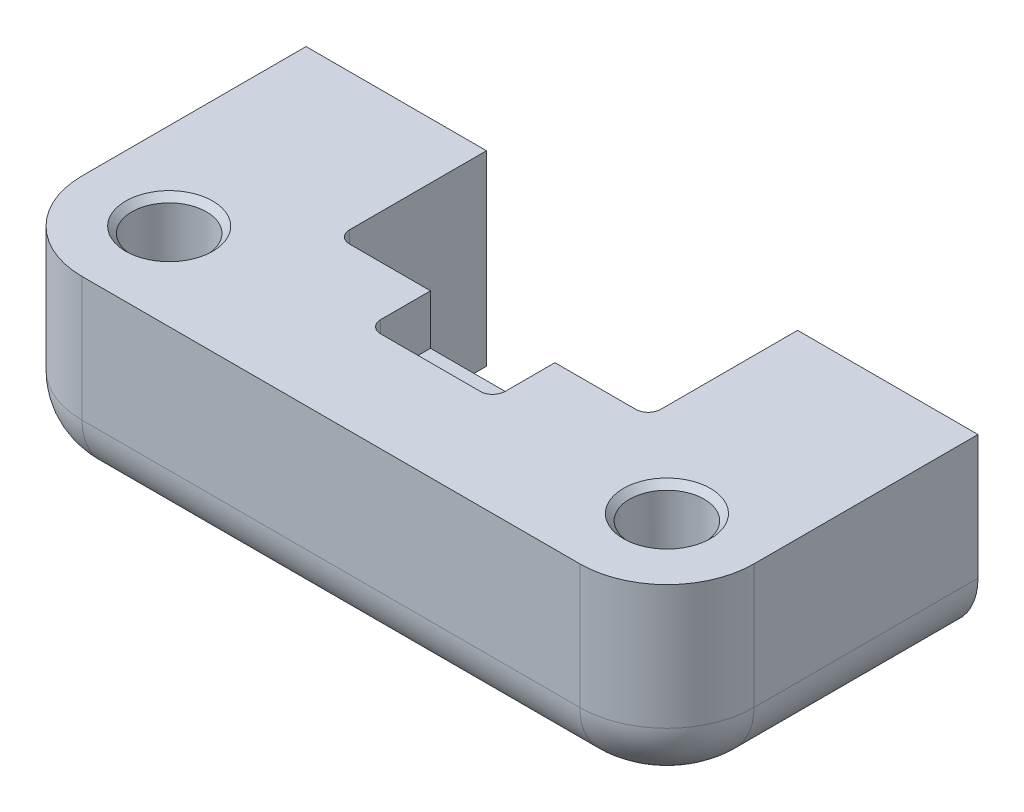
ISO-10303-21;
HEADER;
FILE_DESCRIPTION(('STEP AP214'),'2;1');
FILE_NAME('part.step','',(''),(''),'','','');
FILE_SCHEMA(('AUTOMOTIVE_DESIGN { 1 0 10303 214 1 1 1 1 }'));
ENDSEC;
DATA;
#1=APPLICATION_CONTEXT('core data for automotive mechanical design processes');
#2=APPLICATION_PROTOCOL_DEFINITION('international standard','automotive_design',2000,#1);
#3=PRODUCT_CONTEXT('',#1,'mechanical');
#4=PRODUCT('Part','Part','',(#3));
#5=PRODUCT_RELATED_PRODUCT_CATEGORY('part','',(#4));
#6=PRODUCT_DEFINITION_FORMATION('','',#4);
#7=PRODUCT_DEFINITION_CONTEXT('part definition',#1,'design');
#8=PRODUCT_DEFINITION('design','',#6,#7);
#9=PRODUCT_DEFINITION_SHAPE('','',#8);
#10=(LENGTH_UNIT() NAMED_UNIT(*) SI_UNIT(.MILLI.,.METRE.));
#11=(NAMED_UNIT(*) PLANE_ANGLE_UNIT() SI_UNIT($,.RADIAN.));
#12=(NAMED_UNIT(*) SI_UNIT($,.STERADIAN.) SOLID_ANGLE_UNIT());
#13=UNCERTAINTY_MEASURE_WITH_UNIT(LENGTH_MEASURE(1.E-05),#10,'distance_accuracy_value','');
#14=(GEOMETRIC_REPRESENTATION_CONTEXT(3) GLOBAL_UNCERTAINTY_ASSIGNED_CONTEXT((#13)) GLOBAL_UNIT_ASSIGNED_CONTEXT((#10,
#11,#12)) REPRESENTATION_CONTEXT('',''));
#15=CARTESIAN_POINT('',(0.,0.,0.));
#16=DIRECTION('',(0.,0.,1.));
#17=DIRECTION('',(1.,0.,0.));
#18=AXIS2_PLACEMENT_3D('',#15,#16,#17);
#19=CARTESIAN_POINT('',(0.,0.,0.));
#20=DIRECTION('',(0.,0.,-1.));
#21=DIRECTION('',(-1.,0.,0.));
#22=AXIS2_PLACEMENT_3D('',#19,#20,#21);
#23=PLANE('',#22);
#24=DIRECTION('',(0.,-1.,0.));
#25=VECTOR('',#24,1.);
#26=CARTESIAN_POINT('',(12.5,0.,0.));
#27=LINE('',#26,#25);
#28=CARTESIAN_POINT('',(12.5,7.5,0.));
#29=VERTEX_POINT('',#28);
#30=CARTESIAN_POINT('',(12.5,-7.5,0.));
#31=VERTEX_POINT('',#30);
#32=EDGE_CURVE('E11',#29,#31,#27,.T.);
#33=ORIENTED_EDGE('',*,*,#32,.F.);
#34=DIRECTION('',(-1.,0.,0.));
#35=VECTOR('',#34,1.);
#36=CARTESIAN_POINT('',(-27.,7.5,0.));
#37=LINE('',#36,#35);
#38=CARTESIAN_POINT('',(27.,7.5,0.));
#39=VERTEX_POINT('',#38);
#40=EDGE_CURVE('E282',#39,#29,#37,.T.);
#41=ORIENTED_EDGE('',*,*,#40,.F.);
#42=DIRECTION('',(0.,1.,0.));
#43=VECTOR('',#42,1.);
#44=CARTESIAN_POINT('',(27.,-7.5,0.));
#45=LINE('',#44,#43);
#46=CARTESIAN_POINT('',(27.,-2.5,0.));
#47=VERTEX_POINT('',#46);
#48=EDGE_CURVE('E360',#47,#39,#45,.T.);
#49=ORIENTED_EDGE('',*,*,#48,.F.);
#50=CARTESIAN_POINT('',(22.,-2.5,0.));
#51=DIRECTION('',(0.,0.,-1.));
#52=DIRECTION('',(-1.,0.,0.));
#53=AXIS2_PLACEMENT_3D('',#50,#51,#52);
#54=CIRCLE('',#53,5.);
#55=CARTESIAN_POINT('',(22.,-7.5,0.));
#56=VERTEX_POINT('',#55);
#57=EDGE_CURVE('E294',#47,#56,#54,.T.);
#58=ORIENTED_EDGE('',*,*,#57,.T.);
#59=DIRECTION('',(1.,0.,0.));
#60=VECTOR('',#59,1.);
#61=CARTESIAN_POINT('',(-27.,-7.5,0.));
#62=LINE('',#61,#60);
#63=EDGE_CURVE('E293',#31,#56,#62,.T.);
#64=ORIENTED_EDGE('',*,*,#63,.F.);
#65=EDGE_LOOP('',(#33,#41,#49,#58,#64));
#66=FACE_BOUND('',#65,.T.);
#67=CARTESIAN_POINT('',(20.,-2.49999999999995,0.));
#68=DIRECTION('',(0.,0.,-1.));
#69=DIRECTION('',(-1.,0.,0.));
#70=AXIS2_PLACEMENT_3D('',#67,#68,#69);
#71=CIRCLE('',#70,2.);
#72=CARTESIAN_POINT('',(18.,-2.49999999999995,0.));
#73=VERTEX_POINT('',#72);
#74=EDGE_CURVE('E386',#73,#73,#71,.T.);
#75=ORIENTED_EDGE('',*,*,#74,.F.);
#76=EDGE_LOOP('',(#75));
#77=FACE_BOUND('',#76,.T.);
#78=ADVANCED_FACE('F48',(#66,#77),#23,.T.);
#79=CARTESIAN_POINT('',(27.,-7.5,25.));
#80=DIRECTION('',(-1.,0.,0.));
#81=DIRECTION('',(0.,0.,1.));
#82=AXIS2_PLACEMENT_3D('',#79,#80,#81);
#83=PLANE('',#82);
#84=DIRECTION('',(0.,1.,0.));
#85=VECTOR('',#84,1.);
#86=CARTESIAN_POINT('',(27.,-7.5,18.));
#87=LINE('',#86,#85);
#88=CARTESIAN_POINT('',(27.,7.5,18.));
#89=VERTEX_POINT('',#88);
#90=CARTESIAN_POINT('',(27.,-2.5,18.));
#91=VERTEX_POINT('',#90);
#92=EDGE_CURVE('E323',#89,#91,#87,.F.);
#93=ORIENTED_EDGE('',*,*,#92,.T.);
#94=DIRECTION('',(0.,0.,-1.));
#95=VECTOR('',#94,1.);
#96=CARTESIAN_POINT('',(27.,-2.5,25.));
#97=LINE('',#96,#95);
#98=EDGE_CURVE('E329',#91,#47,#97,.T.);
#99=ORIENTED_EDGE('',*,*,#98,.T.);
#100=ORIENTED_EDGE('',*,*,#48,.T.);
#101=DIRECTION('',(0.,0.,-1.));
#102=VECTOR('',#101,1.);
#103=CARTESIAN_POINT('',(27.,7.5,25.));
#104=LINE('',#103,#102);
#105=EDGE_CURVE('E183',#89,#39,#104,.T.);
#106=ORIENTED_EDGE('',*,*,#105,.F.);
#107=EDGE_LOOP('',(#93,#99,#100,#106));
#108=FACE_BOUND('',#107,.T.);
#109=ADVANCED_FACE('F358',(#108),#83,.F.);
#110=CARTESIAN_POINT('',(-27.,7.5,25.));
#111=DIRECTION('',(0.,-1.,0.));
#112=DIRECTION('',(0.,0.,-1.));
#113=AXIS2_PLACEMENT_3D('',#110,#111,#112);
#114=PLANE('',#113);
#115=CARTESIAN_POINT('',(-20.,7.5,18.));
#116=DIRECTION('',(0.,-1.,0.));
#117=DIRECTION('',(0.,0.,-1.));
#118=AXIS2_PLACEMENT_3D('',#115,#116,#117);
#119=CIRCLE('',#118,3.5);
#120=CARTESIAN_POINT('',(-20.,7.5,14.5));
#121=VERTEX_POINT('',#120);
#122=EDGE_CURVE('E223',#121,#121,#119,.T.);
#123=ORIENTED_EDGE('',*,*,#122,.T.);
#124=EDGE_LOOP('',(#123));
#125=FACE_BOUND('',#124,.T.);
#126=CARTESIAN_POINT('',(20.,7.5,18.));
#127=DIRECTION('',(0.,-1.,0.));
#128=DIRECTION('',(0.,0.,-1.));
#129=AXIS2_PLACEMENT_3D('',#126,#127,#128);
#130=CIRCLE('',#129,3.5);
#131=CARTESIAN_POINT('',(20.,7.5,14.5));
#132=VERTEX_POINT('',#131);
#133=EDGE_CURVE('E210',#132,#132,#130,.T.);
#134=ORIENTED_EDGE('',*,*,#133,.T.);
#135=EDGE_LOOP('',(#134));
#136=FACE_BOUND('',#135,.T.);
#137=DIRECTION('',(1.,0.,0.));
#138=VECTOR('',#137,1.);
#139=CARTESIAN_POINT('',(-11.5,7.5,12.));
#140=LINE('',#139,#138);
#141=CARTESIAN_POINT('',(5.,7.5,12.));
#142=VERTEX_POINT('',#141);
#143=CARTESIAN_POINT('',(11.5,7.5,12.));
#144=VERTEX_POINT('',#143);
#145=EDGE_CURVE('E247',#142,#144,#140,.T.);
#146=ORIENTED_EDGE('',*,*,#145,.F.);
#147=DIRECTION('',(0.,0.,-1.));
#148=VECTOR('',#147,1.);
#149=CARTESIAN_POINT('',(5.,7.5,16.));
#150=LINE('',#149,#148);
#151=CARTESIAN_POINT('',(5.,7.5,16.));
#152=VERTEX_POINT('',#151);
#153=EDGE_CURVE('E454',#152,#142,#150,.T.);
#154=ORIENTED_EDGE('',*,*,#153,.F.);
#155=CARTESIAN_POINT('',(4.,7.5,16.));
#156=DIRECTION('',(0.,1.,0.));
#157=DIRECTION('',(0.,0.,1.));
#158=AXIS2_PLACEMENT_3D('',#155,#156,#157);
#159=CIRCLE('',#158,1.);
#160=CARTESIAN_POINT('',(4.,7.5,17.));
#161=VERTEX_POINT('',#160);
#162=EDGE_CURVE('E438',#161,#152,#159,.T.);
#163=ORIENTED_EDGE('',*,*,#162,.F.);
#164=DIRECTION('',(1.,0.,0.));
#165=VECTOR('',#164,1.);
#166=CARTESIAN_POINT('',(-4.,7.5,17.));
#167=LINE('',#166,#165);
#168=CARTESIAN_POINT('',(-4.,7.5,17.));
#169=VERTEX_POINT('',#168);
#170=EDGE_CURVE('E442',#169,#161,#167,.T.);
#171=ORIENTED_EDGE('',*,*,#170,.F.);
#172=CARTESIAN_POINT('',(-4.,7.5,16.));
#173=DIRECTION('',(0.,1.,0.));
#174=DIRECTION('',(0.,0.,-1.));
#175=AXIS2_PLACEMENT_3D('',#172,#173,#174);
#176=CIRCLE('',#175,1.);
#177=CARTESIAN_POINT('',(-5.,7.5,16.));
#178=VERTEX_POINT('',#177);
#179=EDGE_CURVE('E446',#178,#169,#176,.T.);
#180=ORIENTED_EDGE('',*,*,#179,.F.);
#181=DIRECTION('',(0.,0.,1.));
#182=VECTOR('',#181,1.);
#183=CARTESIAN_POINT('',(-5.,7.5,16.));
#184=LINE('',#183,#182);
#185=CARTESIAN_POINT('',(-5.,7.5,12.));
#186=VERTEX_POINT('',#185);
#187=EDGE_CURVE('E450',#186,#178,#184,.T.);
#188=ORIENTED_EDGE('',*,*,#187,.F.);
#189=CARTESIAN_POINT('',(-11.5,7.5,12.));
#190=VERTEX_POINT('',#189);
#191=EDGE_CURVE('E248',#190,#186,#140,.T.);
#192=ORIENTED_EDGE('',*,*,#191,.F.);
#193=CARTESIAN_POINT('',(-11.5,7.5,11.));
#194=DIRECTION('',(0.,1.,0.));
#195=DIRECTION('',(0.,0.,1.));
#196=AXIS2_PLACEMENT_3D('',#193,#194,#195);
#197=CIRCLE('',#196,1.);
#198=CARTESIAN_POINT('',(-12.5,7.5,11.));
#199=VERTEX_POINT('',#198);
#200=EDGE_CURVE('E245',#199,#190,#197,.T.);
#201=ORIENTED_EDGE('',*,*,#200,.F.);
#202=DIRECTION('',(0.,0.,-1.));
#203=VECTOR('',#202,1.);
#204=CARTESIAN_POINT('',(-12.5,7.5,25.));
#205=LINE('',#204,#203);
#206=CARTESIAN_POINT('',(-12.5,7.5,0.));
#207=VERTEX_POINT('',#206);
#208=EDGE_CURVE('E237',#199,#207,#205,.T.);
#209=ORIENTED_EDGE('',*,*,#208,.T.);
#210=CARTESIAN_POINT('',(-27.,7.5,0.));
#211=VERTEX_POINT('',#210);
#212=EDGE_CURVE('E363',#207,#211,#37,.T.);
#213=ORIENTED_EDGE('',*,*,#212,.T.);
#214=DIRECTION('',(0.,0.,-1.));
#215=VECTOR('',#214,1.);
#216=CARTESIAN_POINT('',(-27.,7.5,25.));
#217=LINE('',#216,#215);
#218=CARTESIAN_POINT('',(-27.,7.5,18.));
#219=VERTEX_POINT('',#218);
#220=EDGE_CURVE('E309',#219,#211,#217,.T.);
#221=ORIENTED_EDGE('',*,*,#220,.F.);
#222=CARTESIAN_POINT('',(-20.,7.5,18.));
#223=DIRECTION('',(0.,-1.,0.));
#224=DIRECTION('',(0.,0.,-1.));
#225=AXIS2_PLACEMENT_3D('',#222,#223,#224);
#226=CIRCLE('',#225,7.);
#227=CARTESIAN_POINT('',(-20.,7.5,25.));
#228=VERTEX_POINT('',#227);
#229=EDGE_CURVE('E317',#219,#228,#226,.F.);
#230=ORIENTED_EDGE('',*,*,#229,.T.);
#231=DIRECTION('',(-1.,0.,0.));
#232=VECTOR('',#231,1.);
#233=CARTESIAN_POINT('',(-27.,7.5,25.));
#234=LINE('',#233,#232);
#235=CARTESIAN_POINT('',(20.,7.5,25.));
#236=VERTEX_POINT('',#235);
#237=EDGE_CURVE('E180',#236,#228,#234,.T.);
#238=ORIENTED_EDGE('',*,*,#237,.F.);
#239=CARTESIAN_POINT('',(20.,7.5,18.));
#240=DIRECTION('',(0.,-1.,0.));
#241=DIRECTION('',(0.,0.,-1.));
#242=AXIS2_PLACEMENT_3D('',#239,#240,#241);
#243=CIRCLE('',#242,7.);
#244=EDGE_CURVE('E320',#236,#89,#243,.F.);
#245=ORIENTED_EDGE('',*,*,#244,.T.);
#246=ORIENTED_EDGE('',*,*,#105,.T.);
#247=ORIENTED_EDGE('',*,*,#40,.T.);
#248=DIRECTION('',(0.,0.,1.));
#249=VECTOR('',#248,1.);
#250=CARTESIAN_POINT('',(12.5,7.5,25.));
#251=LINE('',#250,#249);
#252=CARTESIAN_POINT('',(12.5,7.5,11.));
#253=VERTEX_POINT('',#252);
#254=EDGE_CURVE('E240',#29,#253,#251,.T.);
#255=ORIENTED_EDGE('',*,*,#254,.T.);
#256=CARTESIAN_POINT('',(11.5,7.5,11.));
#257=DIRECTION('',(0.,1.,0.));
#258=DIRECTION('',(0.,0.,1.));
#259=AXIS2_PLACEMENT_3D('',#256,#257,#258);
#260=CIRCLE('',#259,1.);
#261=EDGE_CURVE('E53',#144,#253,#260,.T.);
#262=ORIENTED_EDGE('',*,*,#261,.F.);
#263=EDGE_LOOP('',(#146,#154,#163,#171,#180,#188,#192,#201,#209,#213,#221,#230,#238,#245,#246,
#247,#255,#262));
#264=FACE_BOUND('',#263,.T.);
#265=ADVANCED_FACE('F278',(#125,#136,#264),#114,.F.);
#266=CARTESIAN_POINT('',(-27.,-7.5,25.));
#267=DIRECTION('',(1.,0.,0.));
#268=DIRECTION('',(0.,0.,-1.));
#269=AXIS2_PLACEMENT_3D('',#266,#267,#268);
#270=PLANE('',#269);
#271=DIRECTION('',(0.,-1.,0.));
#272=VECTOR('',#271,1.);
#273=CARTESIAN_POINT('',(-27.,-7.5,0.));
#274=LINE('',#273,#272);
#275=CARTESIAN_POINT('',(-27.,-2.5,0.));
#276=VERTEX_POINT('',#275);
#277=EDGE_CURVE('E300',#211,#276,#274,.T.);
#278=ORIENTED_EDGE('',*,*,#277,.T.);
#279=DIRECTION('',(0.,0.,-1.));
#280=VECTOR('',#279,1.);
#281=CARTESIAN_POINT('',(-27.,-2.5,25.));
#282=LINE('',#281,#280);
#283=CARTESIAN_POINT('',(-27.,-2.5,18.));
#284=VERTEX_POINT('',#283);
#285=EDGE_CURVE('E171',#276,#284,#282,.F.);
#286=ORIENTED_EDGE('',*,*,#285,.T.);
#287=DIRECTION('',(0.,-1.,0.));
#288=VECTOR('',#287,1.);
#289=CARTESIAN_POINT('',(-27.,-7.5,18.));
#290=LINE('',#289,#288);
#291=EDGE_CURVE('E165',#284,#219,#290,.F.);
#292=ORIENTED_EDGE('',*,*,#291,.T.);
#293=ORIENTED_EDGE('',*,*,#220,.T.);
#294=EDGE_LOOP('',(#278,#286,#292,#293));
#295=FACE_BOUND('',#294,.T.);
#296=ADVANCED_FACE('F525',(#295),#270,.F.);
#297=CARTESIAN_POINT('',(-27.,-7.5,25.));
#298=DIRECTION('',(0.,1.,0.));
#299=DIRECTION('',(0.,0.,1.));
#300=AXIS2_PLACEMENT_3D('',#297,#298,#299);
#301=PLANE('',#300);
#302=CARTESIAN_POINT('',(11.5,-7.5,11.));
#303=DIRECTION('',(0.,1.,0.));
#304=DIRECTION('',(0.,0.,1.));
#305=AXIS2_PLACEMENT_3D('',#302,#303,#304);
#306=CIRCLE('',#305,1.);
#307=CARTESIAN_POINT('',(11.5,-7.5,12.));
#308=VERTEX_POINT('',#307);
#309=CARTESIAN_POINT('',(12.5,-7.5,11.));
#310=VERTEX_POINT('',#309);
#311=EDGE_CURVE('E273',#308,#310,#306,.T.);
#312=ORIENTED_EDGE('',*,*,#311,.T.);
#313=DIRECTION('',(0.,0.,-1.));
#314=VECTOR('',#313,1.);
#315=CARTESIAN_POINT('',(12.5,-7.5,11.));
#316=LINE('',#315,#314);
#317=EDGE_CURVE('E397',#310,#31,#316,.T.);
#318=ORIENTED_EDGE('',*,*,#317,.T.);
#319=ORIENTED_EDGE('',*,*,#63,.T.);
#320=DIRECTION('',(0.,0.,-1.));
#321=VECTOR('',#320,1.);
#322=CARTESIAN_POINT('',(22.,-7.5,25.));
#323=LINE('',#322,#321);
#324=CARTESIAN_POINT('',(22.,-7.5,18.));
#325=VERTEX_POINT('',#324);
#326=EDGE_CURVE('E204',#56,#325,#323,.F.);
#327=ORIENTED_EDGE('',*,*,#326,.T.);
#328=CARTESIAN_POINT('',(20.,-7.5,18.));
#329=DIRECTION('',(0.,1.,0.));
#330=DIRECTION('',(0.,0.,1.));
#331=AXIS2_PLACEMENT_3D('',#328,#329,#330);
#332=CIRCLE('',#331,2.);
#333=CARTESIAN_POINT('',(20.,-7.5,20.));
#334=VERTEX_POINT('',#333);
#335=EDGE_CURVE('E346',#325,#334,#332,.F.);
#336=ORIENTED_EDGE('',*,*,#335,.T.);
#337=DIRECTION('',(1.,0.,0.));
#338=VECTOR('',#337,1.);
#339=CARTESIAN_POINT('',(-27.,-7.5,20.));
#340=LINE('',#339,#338);
#341=CARTESIAN_POINT('',(-20.,-7.5,20.));
#342=VERTEX_POINT('',#341);
#343=EDGE_CURVE('E343',#334,#342,#340,.F.);
#344=ORIENTED_EDGE('',*,*,#343,.T.);
#345=CARTESIAN_POINT('',(-20.,-7.5,18.));
#346=DIRECTION('',(0.,1.,0.));
#347=DIRECTION('',(0.,0.,1.));
#348=AXIS2_PLACEMENT_3D('',#345,#346,#347);
#349=CIRCLE('',#348,2.);
#350=CARTESIAN_POINT('',(-22.,-7.5,18.));
#351=VERTEX_POINT('',#350);
#352=EDGE_CURVE('E189',#342,#351,#349,.F.);
#353=ORIENTED_EDGE('',*,*,#352,.T.);
#354=DIRECTION('',(0.,0.,-1.));
#355=VECTOR('',#354,1.);
#356=CARTESIAN_POINT('',(-22.,-7.5,25.));
#357=LINE('',#356,#355);
#358=CARTESIAN_POINT('',(-22.,-7.5,0.));
#359=VERTEX_POINT('',#358);
#360=EDGE_CURVE('E338',#351,#359,#357,.T.);
#361=ORIENTED_EDGE('',*,*,#360,.T.);
#362=CARTESIAN_POINT('',(-12.5,-7.5,0.));
#363=VERTEX_POINT('',#362);
#364=EDGE_CURVE('E299',#359,#363,#62,.T.);
#365=ORIENTED_EDGE('',*,*,#364,.T.);
#366=DIRECTION('',(0.,0.,1.));
#367=VECTOR('',#366,1.);
#368=CARTESIAN_POINT('',(-12.5,-7.5,11.));
#369=LINE('',#368,#367);
#370=CARTESIAN_POINT('',(-12.5,-7.5,11.));
#371=VERTEX_POINT('',#370);
#372=EDGE_CURVE('E76',#363,#371,#369,.T.);
#373=ORIENTED_EDGE('',*,*,#372,.T.);
#374=CARTESIAN_POINT('',(-11.5,-7.5,11.));
#375=DIRECTION('',(0.,1.,0.));
#376=DIRECTION('',(0.,0.,-1.));
#377=AXIS2_PLACEMENT_3D('',#374,#375,#376);
#378=CIRCLE('',#377,1.);
#379=CARTESIAN_POINT('',(-11.5,-7.5,12.));
#380=VERTEX_POINT('',#379);
#381=EDGE_CURVE('E409',#371,#380,#378,.T.);
#382=ORIENTED_EDGE('',*,*,#381,.T.);
#383=DIRECTION('',(1.,0.,0.));
#384=VECTOR('',#383,1.);
#385=CARTESIAN_POINT('',(-11.5,-7.5,12.));
#386=LINE('',#385,#384);
#387=EDGE_CURVE('E406',#380,#308,#386,.T.);
#388=ORIENTED_EDGE('',*,*,#387,.T.);
#389=EDGE_LOOP('',(#312,#318,#319,#327,#336,#344,#353,#361,#365,#373,#382,#388));
#390=FACE_BOUND('',#389,.T.);
#391=ADVANCED_FACE('F350',(#390),#301,.F.);
#392=CARTESIAN_POINT('',(0.,0.,25.));
#393=DIRECTION('',(0.,0.,-1.));
#394=DIRECTION('',(-1.,0.,0.));
#395=AXIS2_PLACEMENT_3D('',#392,#393,#394);
#396=PLANE('',#395);
#397=DIRECTION('',(0.,-1.,0.));
#398=VECTOR('',#397,1.);
#399=CARTESIAN_POINT('',(-20.,0.,25.));
#400=LINE('',#399,#398);
#401=CARTESIAN_POINT('',(-20.,-2.5,25.));
#402=VERTEX_POINT('',#401);
#403=EDGE_CURVE('E164',#228,#402,#400,.T.);
#404=ORIENTED_EDGE('',*,*,#403,.T.);
#405=DIRECTION('',(1.,0.,0.));
#406=VECTOR('',#405,1.);
#407=CARTESIAN_POINT('',(0.,-2.5,25.));
#408=LINE('',#407,#406);
#409=CARTESIAN_POINT('',(20.,-2.5,25.));
#410=VERTEX_POINT('',#409);
#411=EDGE_CURVE('E172',#402,#410,#408,.T.);
#412=ORIENTED_EDGE('',*,*,#411,.T.);
#413=DIRECTION('',(0.,1.,0.));
#414=VECTOR('',#413,1.);
#415=CARTESIAN_POINT('',(20.,0.,25.));
#416=LINE('',#415,#414);
#417=EDGE_CURVE('E182',#410,#236,#416,.T.);
#418=ORIENTED_EDGE('',*,*,#417,.T.);
#419=ORIENTED_EDGE('',*,*,#237,.T.);
#420=EDGE_LOOP('',(#404,#412,#418,#419));
#421=FACE_BOUND('',#420,.T.);
#422=ADVANCED_FACE('F176',(#421),#396,.F.);
#423=DIRECTION('',(0.,1.,0.));
#424=VECTOR('',#423,1.);
#425=CARTESIAN_POINT('',(-12.5,0.,0.));
#426=LINE('',#425,#424);
#427=EDGE_CURVE('E59',#363,#207,#426,.T.);
#428=ORIENTED_EDGE('',*,*,#427,.F.);
#429=ORIENTED_EDGE('',*,*,#364,.F.);
#430=CARTESIAN_POINT('',(-22.,-2.5,0.));
#431=DIRECTION('',(0.,0.,-1.));
#432=DIRECTION('',(-1.,0.,0.));
#433=AXIS2_PLACEMENT_3D('',#430,#431,#432);
#434=CIRCLE('',#433,5.);
#435=EDGE_CURVE('E333',#359,#276,#434,.T.);
#436=ORIENTED_EDGE('',*,*,#435,.T.);
#437=ORIENTED_EDGE('',*,*,#277,.F.);
#438=ORIENTED_EDGE('',*,*,#212,.F.);
#439=EDGE_LOOP('',(#428,#429,#436,#437,#438));
#440=FACE_BOUND('',#439,.T.);
#441=CARTESIAN_POINT('',(-20.,-2.49999999999995,0.));
#442=DIRECTION('',(0.,0.,-1.));
#443=DIRECTION('',(1.,0.,0.));
#444=AXIS2_PLACEMENT_3D('',#441,#442,#443);
#445=CIRCLE('',#444,2.);
#446=CARTESIAN_POINT('',(-18.,-2.49999999999995,0.));
#447=VERTEX_POINT('',#446);
#448=EDGE_CURVE('E382',#447,#447,#445,.T.);
#449=ORIENTED_EDGE('',*,*,#448,.F.);
#450=EDGE_LOOP('',(#449));
#451=FACE_BOUND('',#450,.T.);
#452=ADVANCED_FACE('F519',(#440,#451),#23,.T.);
#453=CARTESIAN_POINT('',(20.,-2.5,18.));
#454=DIRECTION('',(0.,1.,0.));
#455=DIRECTION('',(0.,0.,1.));
#456=AXIS2_PLACEMENT_3D('',#453,#454,#455);
#457=CYLINDRICAL_SURFACE('',#456,3.);
#458=CARTESIAN_POINT('',(20.,7.,18.));
#459=DIRECTION('',(0.,-1.,0.));
#460=DIRECTION('',(0.,0.,-1.));
#461=AXIS2_PLACEMENT_3D('',#458,#459,#460);
#462=CIRCLE('',#461,3.);
#463=CARTESIAN_POINT('',(20.,7.,15.));
#464=VERTEX_POINT('',#463);
#465=EDGE_CURVE('E231',#464,#464,#462,.F.);
#466=ORIENTED_EDGE('',*,*,#465,.T.);
#467=EDGE_LOOP('',(#466));
#468=FACE_BOUND('',#467,.T.);
#469=CARTESIAN_POINT('',(20.,-2.5,18.));
#470=DIRECTION('',(0.,-1.,0.));
#471=DIRECTION('',(0.,0.,1.));
#472=AXIS2_PLACEMENT_3D('',#469,#470,#471);
#473=CIRCLE('',#472,3.);
#474=CARTESIAN_POINT('',(20.,-2.5,21.));
#475=VERTEX_POINT('',#474);
#476=EDGE_CURVE('E369',#475,#475,#473,.T.);
#477=ORIENTED_EDGE('',*,*,#476,.T.);
#478=EDGE_LOOP('',(#477));
#479=FACE_BOUND('',#478,.T.);
#480=ADVANCED_FACE('F549',(#468,#479),#457,.F.);
#481=CARTESIAN_POINT('',(20.,-2.5,18.));
#482=DIRECTION('',(0.,1.,0.));
#483=DIRECTION('',(0.,0.,1.));
#484=AXIS2_PLACEMENT_3D('',#481,#482,#483);
#485=PLANE('',#484);
#486=ORIENTED_EDGE('',*,*,#476,.F.);
#487=EDGE_LOOP('',(#486));
#488=FACE_BOUND('',#487,.T.);
#489=ADVANCED_FACE('F554',(#488),#485,.T.);
#490=CARTESIAN_POINT('',(-20.,-2.5,18.));
#491=DIRECTION('',(0.,1.,0.));
#492=DIRECTION('',(0.,0.,1.));
#493=AXIS2_PLACEMENT_3D('',#490,#491,#492);
#494=CYLINDRICAL_SURFACE('',#493,3.);
#495=CARTESIAN_POINT('',(-20.,6.99999999999999,18.));
#496=DIRECTION('',(0.,-1.,0.));
#497=DIRECTION('',(0.,0.,-1.));
#498=AXIS2_PLACEMENT_3D('',#495,#496,#497);
#499=CIRCLE('',#498,3.);
#500=CARTESIAN_POINT('',(-20.,6.99999999999999,15.));
#501=VERTEX_POINT('',#500);
#502=EDGE_CURVE('E227',#501,#501,#499,.F.);
#503=ORIENTED_EDGE('',*,*,#502,.T.);
#504=EDGE_LOOP('',(#503));
#505=FACE_BOUND('',#504,.T.);
#506=CARTESIAN_POINT('',(-20.,-2.5,18.));
#507=DIRECTION('',(0.,-1.,0.));
#508=DIRECTION('',(0.,0.,-1.));
#509=AXIS2_PLACEMENT_3D('',#506,#507,#508);
#510=CIRCLE('',#509,3.);
#511=CARTESIAN_POINT('',(-20.,-2.5,15.));
#512=VERTEX_POINT('',#511);
#513=EDGE_CURVE('E364',#512,#512,#510,.T.);
#514=ORIENTED_EDGE('',*,*,#513,.T.);
#515=EDGE_LOOP('',(#514));
#516=FACE_BOUND('',#515,.T.);
#517=ADVANCED_FACE('F564',(#505,#516),#494,.F.);
#518=CARTESIAN_POINT('',(-20.,-2.5,18.));
#519=DIRECTION('',(0.,-1.,0.));
#520=DIRECTION('',(0.,0.,-1.));
#521=AXIS2_PLACEMENT_3D('',#518,#519,#520);
#522=PLANE('',#521);
#523=ORIENTED_EDGE('',*,*,#513,.F.);
#524=EDGE_LOOP('',(#523));
#525=FACE_BOUND('',#524,.T.);
#526=ADVANCED_FACE('F569',(#525),#522,.F.);
#527=CARTESIAN_POINT('',(-20.,-2.49999999999995,9.));
#528=DIRECTION('',(0.,0.,-1.));
#529=DIRECTION('',(-1.,0.,0.));
#530=AXIS2_PLACEMENT_3D('',#527,#528,#529);
#531=CYLINDRICAL_SURFACE('',#530,2.);
#532=CARTESIAN_POINT('',(-20.,-2.49999999999995,9.));
#533=DIRECTION('',(0.,0.,-1.));
#534=DIRECTION('',(1.,0.,0.));
#535=AXIS2_PLACEMENT_3D('',#532,#533,#534);
#536=CIRCLE('',#535,2.);
#537=CARTESIAN_POINT('',(-18.,-2.49999999999995,9.));
#538=VERTEX_POINT('',#537);
#539=EDGE_CURVE('E219',#538,#538,#536,.T.);
#540=ORIENTED_EDGE('',*,*,#539,.F.);
#541=EDGE_LOOP('',(#540));
#542=FACE_BOUND('',#541,.T.);
#543=ORIENTED_EDGE('',*,*,#448,.T.);
#544=EDGE_LOOP('',(#543));
#545=FACE_BOUND('',#544,.T.);
#546=ADVANCED_FACE('F573',(#542,#545),#531,.F.);
#547=CARTESIAN_POINT('',(-20.,-2.49999999999995,9.));
#548=DIRECTION('',(0.,0.,1.));
#549=DIRECTION('',(1.,0.,0.));
#550=AXIS2_PLACEMENT_3D('',#547,#548,#549);
#551=PLANE('',#550);
#552=ORIENTED_EDGE('',*,*,#539,.T.);
#553=EDGE_LOOP('',(#552));
#554=FACE_BOUND('',#553,.T.);
#555=ADVANCED_FACE('F575',(#554),#551,.F.);
#556=CARTESIAN_POINT('',(20.,-2.49999999999995,9.));
#557=DIRECTION('',(0.,0.,-1.));
#558=DIRECTION('',(-1.,0.,0.));
#559=AXIS2_PLACEMENT_3D('',#556,#557,#558);
#560=CYLINDRICAL_SURFACE('',#559,2.);
#561=CARTESIAN_POINT('',(20.,-2.49999999999995,9.));
#562=DIRECTION('',(0.,0.,-1.));
#563=DIRECTION('',(-1.,0.,0.));
#564=AXIS2_PLACEMENT_3D('',#561,#562,#563);
#565=CIRCLE('',#564,2.);
#566=CARTESIAN_POINT('',(18.,-2.49999999999995,9.));
#567=VERTEX_POINT('',#566);
#568=EDGE_CURVE('E377',#567,#567,#565,.T.);
#569=ORIENTED_EDGE('',*,*,#568,.F.);
#570=EDGE_LOOP('',(#569));
#571=FACE_BOUND('',#570,.T.);
#572=ORIENTED_EDGE('',*,*,#74,.T.);
#573=EDGE_LOOP('',(#572));
#574=FACE_BOUND('',#573,.T.);
#575=ADVANCED_FACE('F578',(#571,#574),#560,.F.);
#576=CARTESIAN_POINT('',(20.,-2.49999999999995,9.));
#577=DIRECTION('',(0.,0.,-1.));
#578=DIRECTION('',(-1.,0.,0.));
#579=AXIS2_PLACEMENT_3D('',#576,#577,#578);
#580=PLANE('',#579);
#581=ORIENTED_EDGE('',*,*,#568,.T.);
#582=EDGE_LOOP('',(#581));
#583=FACE_BOUND('',#582,.T.);
#584=ADVANCED_FACE('F585',(#583),#580,.T.);
#585=CARTESIAN_POINT('',(20.,0.,18.));
#586=DIRECTION('',(0.,1.,0.));
#587=DIRECTION('',(0.,0.,1.));
#588=AXIS2_PLACEMENT_3D('',#585,#586,#587);
#589=CYLINDRICAL_SURFACE('',#588,7.);
#590=ORIENTED_EDGE('',*,*,#417,.F.);
#591=CARTESIAN_POINT('',(20.,-2.5,18.));
#592=DIRECTION('',(0.,1.,0.));
#593=DIRECTION('',(0.,0.,1.));
#594=AXIS2_PLACEMENT_3D('',#591,#592,#593);
#595=CIRCLE('',#594,7.);
#596=EDGE_CURVE('E201',#410,#91,#595,.T.);
#597=ORIENTED_EDGE('',*,*,#596,.T.);
#598=ORIENTED_EDGE('',*,*,#92,.F.);
#599=ORIENTED_EDGE('',*,*,#244,.F.);
#600=EDGE_LOOP('',(#590,#597,#598,#599));
#601=FACE_BOUND('',#600,.T.);
#602=ADVANCED_FACE('F536',(#601),#589,.T.);
#603=CARTESIAN_POINT('',(-20.,0.,18.));
#604=DIRECTION('',(0.,-1.,0.));
#605=DIRECTION('',(0.,0.,-1.));
#606=AXIS2_PLACEMENT_3D('',#603,#604,#605);
#607=CYLINDRICAL_SURFACE('',#606,7.);
#608=ORIENTED_EDGE('',*,*,#291,.F.);
#609=CARTESIAN_POINT('',(-20.,-2.5,18.));
#610=DIRECTION('',(0.,1.,0.));
#611=DIRECTION('',(0.,0.,1.));
#612=AXIS2_PLACEMENT_3D('',#609,#610,#611);
#613=CIRCLE('',#612,7.);
#614=EDGE_CURVE('E160',#284,#402,#613,.T.);
#615=ORIENTED_EDGE('',*,*,#614,.T.);
#616=ORIENTED_EDGE('',*,*,#403,.F.);
#617=ORIENTED_EDGE('',*,*,#229,.F.);
#618=EDGE_LOOP('',(#608,#615,#616,#617));
#619=FACE_BOUND('',#618,.T.);
#620=ADVANCED_FACE('F162',(#619),#607,.T.);
#621=CARTESIAN_POINT('',(-22.,-2.5,25.));
#622=DIRECTION('',(0.,0.,-1.));
#623=DIRECTION('',(-1.,0.,0.));
#624=AXIS2_PLACEMENT_3D('',#621,#622,#623);
#625=CYLINDRICAL_SURFACE('',#624,5.);
#626=ORIENTED_EDGE('',*,*,#435,.F.);
#627=ORIENTED_EDGE('',*,*,#360,.F.);
#628=CARTESIAN_POINT('',(-22.,-2.5,18.));
#629=DIRECTION('',(0.,0.,1.));
#630=DIRECTION('',(1.,0.,0.));
#631=AXIS2_PLACEMENT_3D('',#628,#629,#630);
#632=CIRCLE('',#631,5.);
#633=EDGE_CURVE('E193',#284,#351,#632,.T.);
#634=ORIENTED_EDGE('',*,*,#633,.F.);
#635=ORIENTED_EDGE('',*,*,#285,.F.);
#636=EDGE_LOOP('',(#626,#627,#634,#635));
#637=FACE_BOUND('',#636,.T.);
#638=ADVANCED_FACE('F527',(#637),#625,.T.);
#639=CARTESIAN_POINT('',(-20.,-2.5,18.));
#640=DIRECTION('',(0.,1.,0.));
#641=DIRECTION('',(0.,0.,1.));
#642=AXIS2_PLACEMENT_3D('',#639,#640,#641);
#643=DEGENERATE_TOROIDAL_SURFACE('',#642,2.,5.,.T.);
#644=ORIENTED_EDGE('',*,*,#633,.T.);
#645=ORIENTED_EDGE('',*,*,#352,.F.);
#646=CARTESIAN_POINT('',(-20.,-2.5,20.));
#647=DIRECTION('',(1.,0.,0.));
#648=DIRECTION('',(0.,0.,-1.));
#649=AXIS2_PLACEMENT_3D('',#646,#647,#648);
#650=CIRCLE('',#649,5.);
#651=EDGE_CURVE('E187',#402,#342,#650,.T.);
#652=ORIENTED_EDGE('',*,*,#651,.F.);
#653=ORIENTED_EDGE('',*,*,#614,.F.);
#654=EDGE_LOOP('',(#644,#645,#652,#653));
#655=FACE_BOUND('',#654,.T.);
#656=ADVANCED_FACE('F188',(#655),#643,.T.);
#657=CARTESIAN_POINT('',(0.,-2.5,20.));
#658=DIRECTION('',(1.,0.,0.));
#659=DIRECTION('',(0.,0.,-1.));
#660=AXIS2_PLACEMENT_3D('',#657,#658,#659);
#661=CYLINDRICAL_SURFACE('',#660,5.);
#662=ORIENTED_EDGE('',*,*,#651,.T.);
#663=ORIENTED_EDGE('',*,*,#343,.F.);
#664=CARTESIAN_POINT('',(20.,-2.5,20.));
#665=DIRECTION('',(1.,0.,0.));
#666=DIRECTION('',(0.,0.,-1.));
#667=AXIS2_PLACEMENT_3D('',#664,#665,#666);
#668=CIRCLE('',#667,5.);
#669=EDGE_CURVE('E194',#410,#334,#668,.T.);
#670=ORIENTED_EDGE('',*,*,#669,.F.);
#671=ORIENTED_EDGE('',*,*,#411,.F.);
#672=EDGE_LOOP('',(#662,#663,#670,#671));
#673=FACE_BOUND('',#672,.T.);
#674=ADVANCED_FACE('F197',(#673),#661,.T.);
#675=CARTESIAN_POINT('',(20.,-2.5,18.));
#676=DIRECTION('',(0.,1.,0.));
#677=DIRECTION('',(0.,0.,1.));
#678=AXIS2_PLACEMENT_3D('',#675,#676,#677);
#679=DEGENERATE_TOROIDAL_SURFACE('',#678,2.,5.,.T.);
#680=ORIENTED_EDGE('',*,*,#669,.T.);
#681=ORIENTED_EDGE('',*,*,#335,.F.);
#682=CARTESIAN_POINT('',(22.,-2.5,18.));
#683=DIRECTION('',(0.,0.,-1.));
#684=DIRECTION('',(-1.,0.,0.));
#685=AXIS2_PLACEMENT_3D('',#682,#683,#684);
#686=CIRCLE('',#685,5.);
#687=EDGE_CURVE('E211',#91,#325,#686,.T.);
#688=ORIENTED_EDGE('',*,*,#687,.F.);
#689=ORIENTED_EDGE('',*,*,#596,.F.);
#690=EDGE_LOOP('',(#680,#681,#688,#689));
#691=FACE_BOUND('',#690,.T.);
#692=ADVANCED_FACE('F354',(#691),#679,.T.);
#693=CARTESIAN_POINT('',(22.,-2.5,25.));
#694=DIRECTION('',(0.,0.,-1.));
#695=DIRECTION('',(-1.,0.,0.));
#696=AXIS2_PLACEMENT_3D('',#693,#694,#695);
#697=CYLINDRICAL_SURFACE('',#696,5.);
#698=ORIENTED_EDGE('',*,*,#687,.T.);
#699=ORIENTED_EDGE('',*,*,#326,.F.);
#700=ORIENTED_EDGE('',*,*,#57,.F.);
#701=ORIENTED_EDGE('',*,*,#98,.F.);
#702=EDGE_LOOP('',(#698,#699,#700,#701));
#703=FACE_BOUND('',#702,.T.);
#704=ADVANCED_FACE('F356',(#703),#697,.T.);
#705=CARTESIAN_POINT('',(-20.,7.5,18.));
#706=DIRECTION('',(0.,1.,0.));
#707=DIRECTION('',(0.,0.,1.));
#708=AXIS2_PLACEMENT_3D('',#705,#706,#707);
#709=CONICAL_SURFACE('',#708,3.5,0.785398163397445);
#710=ORIENTED_EDGE('',*,*,#502,.F.);
#711=EDGE_LOOP('',(#710));
#712=FACE_BOUND('',#711,.T.);
#713=ORIENTED_EDGE('',*,*,#122,.F.);
#714=EDGE_LOOP('',(#713));
#715=FACE_BOUND('',#714,.T.);
#716=ADVANCED_FACE('F691',(#712,#715),#709,.F.);
#717=CARTESIAN_POINT('',(20.,7.5,18.));
#718=DIRECTION('',(0.,1.,0.));
#719=DIRECTION('',(0.,0.,1.));
#720=AXIS2_PLACEMENT_3D('',#717,#718,#719);
#721=CONICAL_SURFACE('',#720,3.5,0.785398163397444);
#722=ORIENTED_EDGE('',*,*,#465,.F.);
#723=EDGE_LOOP('',(#722));
#724=FACE_BOUND('',#723,.T.);
#725=ORIENTED_EDGE('',*,*,#133,.F.);
#726=EDGE_LOOP('',(#725));
#727=FACE_BOUND('',#726,.T.);
#728=ADVANCED_FACE('F51',(#724,#727),#721,.F.);
#729=CARTESIAN_POINT('',(11.5,-7.5,11.));
#730=DIRECTION('',(0.,1.,0.));
#731=DIRECTION('',(0.,0.,1.));
#732=AXIS2_PLACEMENT_3D('',#729,#730,#731);
#733=CYLINDRICAL_SURFACE('',#732,1.);
#734=DIRECTION('',(0.,1.,0.));
#735=VECTOR('',#734,1.);
#736=CARTESIAN_POINT('',(12.5,-7.5,11.));
#737=LINE('',#736,#735);
#738=EDGE_CURVE('E241',#310,#253,#737,.T.);
#739=ORIENTED_EDGE('',*,*,#738,.F.);
#740=ORIENTED_EDGE('',*,*,#311,.F.);
#741=DIRECTION('',(0.,1.,0.));
#742=VECTOR('',#741,1.);
#743=CARTESIAN_POINT('',(11.5,-7.5,12.));
#744=LINE('',#743,#742);
#745=EDGE_CURVE('E265',#308,#144,#744,.T.);
#746=ORIENTED_EDGE('',*,*,#745,.T.);
#747=ORIENTED_EDGE('',*,*,#261,.T.);
#748=EDGE_LOOP('',(#739,#740,#746,#747));
#749=FACE_BOUND('',#748,.T.);
#750=ADVANCED_FACE('F271',(#749),#733,.F.);
#751=CARTESIAN_POINT('',(-11.5,-7.5,12.));
#752=DIRECTION('',(0.,0.,1.));
#753=DIRECTION('',(1.,0.,0.));
#754=AXIS2_PLACEMENT_3D('',#751,#752,#753);
#755=PLANE('',#754);
#756=DIRECTION('',(-1.,0.,0.));
#757=VECTOR('',#756,1.);
#758=CARTESIAN_POINT('',(-5.,3.5,12.));
#759=LINE('',#758,#757);
#760=CARTESIAN_POINT('',(5.,3.5,12.));
#761=VERTEX_POINT('',#760);
#762=CARTESIAN_POINT('',(-5.,3.5,12.));
#763=VERTEX_POINT('',#762);
#764=EDGE_CURVE('E472',#761,#763,#759,.T.);
#765=ORIENTED_EDGE('',*,*,#764,.F.);
#766=DIRECTION('',(0.,1.,0.));
#767=VECTOR('',#766,1.);
#768=CARTESIAN_POINT('',(5.,3.5,12.));
#769=LINE('',#768,#767);
#770=EDGE_CURVE('E268',#761,#142,#769,.T.);
#771=ORIENTED_EDGE('',*,*,#770,.T.);
#772=ORIENTED_EDGE('',*,*,#145,.T.);
#773=ORIENTED_EDGE('',*,*,#745,.F.);
#774=ORIENTED_EDGE('',*,*,#387,.F.);
#775=DIRECTION('',(0.,1.,0.));
#776=VECTOR('',#775,1.);
#777=CARTESIAN_POINT('',(-11.5,-7.5,12.));
#778=LINE('',#777,#776);
#779=EDGE_CURVE('E276',#380,#190,#778,.T.);
#780=ORIENTED_EDGE('',*,*,#779,.T.);
#781=ORIENTED_EDGE('',*,*,#191,.T.);
#782=DIRECTION('',(0.,1.,0.));
#783=VECTOR('',#782,1.);
#784=CARTESIAN_POINT('',(-5.,3.5,12.));
#785=LINE('',#784,#783);
#786=EDGE_CURVE('E418',#763,#186,#785,.T.);
#787=ORIENTED_EDGE('',*,*,#786,.F.);
#788=EDGE_LOOP('',(#765,#771,#772,#773,#774,#780,#781,#787));
#789=FACE_BOUND('',#788,.T.);
#790=ADVANCED_FACE('F262',(#789),#755,.F.);
#791=CARTESIAN_POINT('',(-11.5,-7.5,11.));
#792=DIRECTION('',(0.,1.,0.));
#793=DIRECTION('',(0.,0.,1.));
#794=AXIS2_PLACEMENT_3D('',#791,#792,#793);
#795=CYLINDRICAL_SURFACE('',#794,1.);
#796=ORIENTED_EDGE('',*,*,#779,.F.);
#797=ORIENTED_EDGE('',*,*,#381,.F.);
#798=DIRECTION('',(0.,1.,0.));
#799=VECTOR('',#798,1.);
#800=CARTESIAN_POINT('',(-12.5,-7.5,11.));
#801=LINE('',#800,#799);
#802=EDGE_CURVE('E393',#371,#199,#801,.T.);
#803=ORIENTED_EDGE('',*,*,#802,.T.);
#804=ORIENTED_EDGE('',*,*,#200,.T.);
#805=EDGE_LOOP('',(#796,#797,#803,#804));
#806=FACE_BOUND('',#805,.T.);
#807=ADVANCED_FACE('F514',(#806),#795,.F.);
#808=CARTESIAN_POINT('',(12.5,-7.5,11.));
#809=DIRECTION('',(1.,0.,0.));
#810=DIRECTION('',(0.,0.,-1.));
#811=AXIS2_PLACEMENT_3D('',#808,#809,#810);
#812=PLANE('',#811);
#813=ORIENTED_EDGE('',*,*,#32,.T.);
#814=ORIENTED_EDGE('',*,*,#317,.F.);
#815=ORIENTED_EDGE('',*,*,#738,.T.);
#816=ORIENTED_EDGE('',*,*,#254,.F.);
#817=EDGE_LOOP('',(#813,#814,#815,#816));
#818=FACE_BOUND('',#817,.T.);
#819=ADVANCED_FACE('F285',(#818),#812,.F.);
#820=CARTESIAN_POINT('',(-12.5,-7.5,11.));
#821=DIRECTION('',(-1.,0.,0.));
#822=DIRECTION('',(0.,0.,1.));
#823=AXIS2_PLACEMENT_3D('',#820,#821,#822);
#824=PLANE('',#823);
#825=ORIENTED_EDGE('',*,*,#802,.F.);
#826=ORIENTED_EDGE('',*,*,#372,.F.);
#827=ORIENTED_EDGE('',*,*,#427,.T.);
#828=ORIENTED_EDGE('',*,*,#208,.F.);
#829=EDGE_LOOP('',(#825,#826,#827,#828));
#830=FACE_BOUND('',#829,.T.);
#831=ADVANCED_FACE('F590',(#830),#824,.F.);
#832=CARTESIAN_POINT('',(5.,3.5,16.));
#833=DIRECTION('',(1.,0.,0.));
#834=DIRECTION('',(0.,0.,-1.));
#835=AXIS2_PLACEMENT_3D('',#832,#833,#834);
#836=PLANE('',#835);
#837=ORIENTED_EDGE('',*,*,#153,.T.);
#838=ORIENTED_EDGE('',*,*,#770,.F.);
#839=DIRECTION('',(0.,0.,-1.));
#840=VECTOR('',#839,1.);
#841=CARTESIAN_POINT('',(5.,3.5,16.));
#842=LINE('',#841,#840);
#843=CARTESIAN_POINT('',(5.,3.5,16.));
#844=VERTEX_POINT('',#843);
#845=EDGE_CURVE('E67',#844,#761,#842,.T.);
#846=ORIENTED_EDGE('',*,*,#845,.F.);
#847=DIRECTION('',(0.,1.,0.));
#848=VECTOR('',#847,1.);
#849=CARTESIAN_POINT('',(5.,3.5,16.));
#850=LINE('',#849,#848);
#851=EDGE_CURVE('E415',#844,#152,#850,.T.);
#852=ORIENTED_EDGE('',*,*,#851,.T.);
#853=EDGE_LOOP('',(#837,#838,#846,#852));
#854=FACE_BOUND('',#853,.T.);
#855=ADVANCED_FACE('F593',(#854),#836,.F.);
#856=CARTESIAN_POINT('',(4.,3.5,16.));
#857=DIRECTION('',(0.,1.,0.));
#858=DIRECTION('',(0.,0.,1.));
#859=AXIS2_PLACEMENT_3D('',#856,#857,#858);
#860=CYLINDRICAL_SURFACE('',#859,1.);
#861=ORIENTED_EDGE('',*,*,#162,.T.);
#862=ORIENTED_EDGE('',*,*,#851,.F.);
#863=CARTESIAN_POINT('',(4.,3.5,16.));
#864=DIRECTION('',(0.,1.,0.));
#865=DIRECTION('',(0.,0.,1.));
#866=AXIS2_PLACEMENT_3D('',#863,#864,#865);
#867=CIRCLE('',#866,1.);
#868=CARTESIAN_POINT('',(4.,3.5,17.));
#869=VERTEX_POINT('',#868);
#870=EDGE_CURVE('E419',#869,#844,#867,.T.);
#871=ORIENTED_EDGE('',*,*,#870,.F.);
#872=DIRECTION('',(0.,1.,0.));
#873=VECTOR('',#872,1.);
#874=CARTESIAN_POINT('',(4.,3.5,17.));
#875=LINE('',#874,#873);
#876=EDGE_CURVE('E431',#869,#161,#875,.T.);
#877=ORIENTED_EDGE('',*,*,#876,.T.);
#878=EDGE_LOOP('',(#861,#862,#871,#877));
#879=FACE_BOUND('',#878,.T.);
#880=ADVANCED_FACE('F603',(#879),#860,.F.);
#881=CARTESIAN_POINT('',(-4.,3.5,17.));
#882=DIRECTION('',(0.,0.,1.));
#883=DIRECTION('',(1.,0.,0.));
#884=AXIS2_PLACEMENT_3D('',#881,#882,#883);
#885=PLANE('',#884);
#886=ORIENTED_EDGE('',*,*,#170,.T.);
#887=ORIENTED_EDGE('',*,*,#876,.F.);
#888=DIRECTION('',(1.,0.,0.));
#889=VECTOR('',#888,1.);
#890=CARTESIAN_POINT('',(-4.,3.5,17.));
#891=LINE('',#890,#889);
#892=CARTESIAN_POINT('',(-4.,3.5,17.));
#893=VERTEX_POINT('',#892);
#894=EDGE_CURVE('E460',#893,#869,#891,.T.);
#895=ORIENTED_EDGE('',*,*,#894,.F.);
#896=DIRECTION('',(0.,1.,0.));
#897=VECTOR('',#896,1.);
#898=CARTESIAN_POINT('',(-4.,3.5,17.));
#899=LINE('',#898,#897);
#900=EDGE_CURVE('E427',#893,#169,#899,.T.);
#901=ORIENTED_EDGE('',*,*,#900,.T.);
#902=EDGE_LOOP('',(#886,#887,#895,#901));
#903=FACE_BOUND('',#902,.T.);
#904=ADVANCED_FACE('F609',(#903),#885,.F.);
#905=CARTESIAN_POINT('',(-4.,3.5,16.));
#906=DIRECTION('',(0.,1.,0.));
#907=DIRECTION('',(0.,0.,1.));
#908=AXIS2_PLACEMENT_3D('',#905,#906,#907);
#909=CYLINDRICAL_SURFACE('',#908,1.);
#910=ORIENTED_EDGE('',*,*,#179,.T.);
#911=ORIENTED_EDGE('',*,*,#900,.F.);
#912=CARTESIAN_POINT('',(-4.,3.5,16.));
#913=DIRECTION('',(0.,1.,0.));
#914=DIRECTION('',(0.,0.,-1.));
#915=AXIS2_PLACEMENT_3D('',#912,#913,#914);
#916=CIRCLE('',#915,1.);
#917=CARTESIAN_POINT('',(-5.,3.5,16.));
#918=VERTEX_POINT('',#917);
#919=EDGE_CURVE('E464',#918,#893,#916,.T.);
#920=ORIENTED_EDGE('',*,*,#919,.F.);
#921=DIRECTION('',(0.,1.,0.));
#922=VECTOR('',#921,1.);
#923=CARTESIAN_POINT('',(-5.,3.5,16.));
#924=LINE('',#923,#922);
#925=EDGE_CURVE('E423',#918,#178,#924,.T.);
#926=ORIENTED_EDGE('',*,*,#925,.T.);
#927=EDGE_LOOP('',(#910,#911,#920,#926));
#928=FACE_BOUND('',#927,.T.);
#929=ADVANCED_FACE('F496',(#928),#909,.F.);
#930=CARTESIAN_POINT('',(-5.,3.5,16.));
#931=DIRECTION('',(-1.,0.,0.));
#932=DIRECTION('',(0.,0.,1.));
#933=AXIS2_PLACEMENT_3D('',#930,#931,#932);
#934=PLANE('',#933);
#935=ORIENTED_EDGE('',*,*,#187,.T.);
#936=ORIENTED_EDGE('',*,*,#925,.F.);
#937=DIRECTION('',(0.,0.,1.));
#938=VECTOR('',#937,1.);
#939=CARTESIAN_POINT('',(-5.,3.5,16.));
#940=LINE('',#939,#938);
#941=EDGE_CURVE('E468',#763,#918,#940,.T.);
#942=ORIENTED_EDGE('',*,*,#941,.F.);
#943=ORIENTED_EDGE('',*,*,#786,.T.);
#944=EDGE_LOOP('',(#935,#936,#942,#943));
#945=FACE_BOUND('',#944,.T.);
#946=ADVANCED_FACE('F484',(#945),#934,.F.);
#947=CARTESIAN_POINT('',(-4.,3.5,16.));
#948=DIRECTION('',(0.,-1.,0.));
#949=DIRECTION('',(0.,0.,-1.));
#950=AXIS2_PLACEMENT_3D('',#947,#948,#949);
#951=PLANE('',#950);
#952=ORIENTED_EDGE('',*,*,#845,.T.);
#953=ORIENTED_EDGE('',*,*,#764,.T.);
#954=ORIENTED_EDGE('',*,*,#941,.T.);
#955=ORIENTED_EDGE('',*,*,#919,.T.);
#956=ORIENTED_EDGE('',*,*,#894,.T.);
#957=ORIENTED_EDGE('',*,*,#870,.T.);
#958=EDGE_LOOP('',(#952,#953,#954,#955,#956,#957));
#959=FACE_BOUND('',#958,.T.);
#960=ADVANCED_FACE('F477',(#959),#951,.F.);
#961=CLOSED_SHELL('',(#78,#109,#265,#296,#391,#422,#452,#480,#489,#517,#526,#546,#555,#575,#584,
#602,#620,#638,#656,#674,#692,#704,#716,#728,#750,#790,#807,#819,#831,#855,#880,#904,#929,#946,#960));
#962=MANIFOLD_SOLID_BREP('B2',#961);
#963=ADVANCED_BREP_SHAPE_REPRESENTATION('',(#18,#962),#14);
#964=SHAPE_DEFINITION_REPRESENTATION(#9,#963);
ENDSEC;
END-ISO-10303-21;
